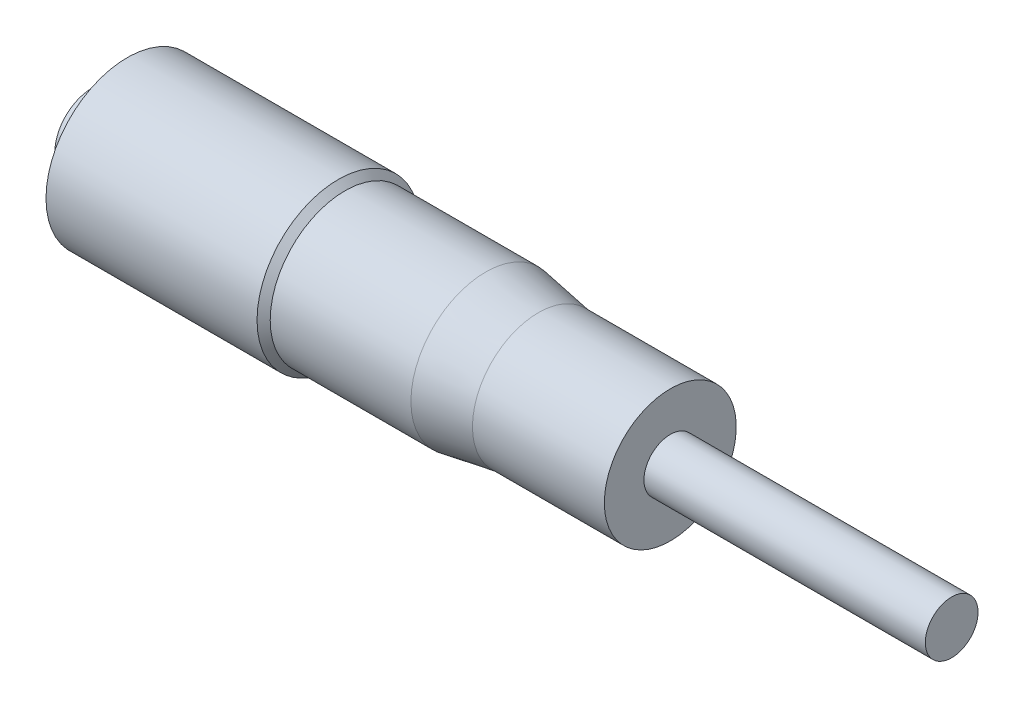
ISO-10303-21;
HEADER;
FILE_DESCRIPTION(('STEP AP214'),'2;1');
FILE_NAME('part.step','',(''),(''),'','','');
FILE_SCHEMA(('AUTOMOTIVE_DESIGN { 1 0 10303 214 1 1 1 1 }'));
ENDSEC;
DATA;
#1=APPLICATION_CONTEXT('core data for automotive mechanical design processes');
#2=APPLICATION_PROTOCOL_DEFINITION('international standard','automotive_design',2000,#1);
#3=PRODUCT_CONTEXT('',#1,'mechanical');
#4=PRODUCT('Part','Part','',(#3));
#5=PRODUCT_RELATED_PRODUCT_CATEGORY('part','',(#4));
#6=PRODUCT_DEFINITION_FORMATION('','',#4);
#7=PRODUCT_DEFINITION_CONTEXT('part definition',#1,'design');
#8=PRODUCT_DEFINITION('design','',#6,#7);
#9=PRODUCT_DEFINITION_SHAPE('','',#8);
#10=(LENGTH_UNIT() NAMED_UNIT(*) SI_UNIT(.MILLI.,.METRE.));
#11=(NAMED_UNIT(*) PLANE_ANGLE_UNIT() SI_UNIT($,.RADIAN.));
#12=(NAMED_UNIT(*) SI_UNIT($,.STERADIAN.) SOLID_ANGLE_UNIT());
#13=UNCERTAINTY_MEASURE_WITH_UNIT(LENGTH_MEASURE(1.E-05),#10,'distance_accuracy_value','');
#14=(GEOMETRIC_REPRESENTATION_CONTEXT(3) GLOBAL_UNCERTAINTY_ASSIGNED_CONTEXT((#13)) GLOBAL_UNIT_ASSIGNED_CONTEXT((#10,
#11,#12)) REPRESENTATION_CONTEXT('',''));
#15=CARTESIAN_POINT('',(0.,0.,0.));
#16=DIRECTION('',(0.,0.,1.));
#17=DIRECTION('',(1.,0.,0.));
#18=AXIS2_PLACEMENT_3D('',#15,#16,#17);
#19=CARTESIAN_POINT('',(-39.8437499999999,0.,0.));
#20=DIRECTION('',(-1.,0.,0.));
#21=DIRECTION('',(0.,1.,0.));
#22=AXIS2_PLACEMENT_3D('',#19,#20,#21);
#23=SPHERICAL_SURFACE('',#22,9.53125000000007);
#24=CARTESIAN_POINT('',(-48.375,0.,0.));
#25=DIRECTION('',(-1.,0.,0.));
#26=DIRECTION('',(0.,0.,1.));
#27=AXIS2_PLACEMENT_3D('',#24,#25,#26);
#28=CIRCLE('',#27,4.25000000000001);
#29=CARTESIAN_POINT('',(-48.375,0.,4.25000000000001));
#30=VERTEX_POINT('',#29);
#31=EDGE_CURVE('E80',#30,#30,#28,.T.);
#32=ORIENTED_EDGE('',*,*,#31,.T.);
#33=EDGE_LOOP('',(#32));
#34=FACE_BOUND('',#33,.T.);
#35=ADVANCED_FACE('F37',(#34),#23,.T.);
#36=CARTESIAN_POINT('',(49.375,0.,0.));
#37=DIRECTION('',(-1.,0.,0.));
#38=DIRECTION('',(0.,0.,1.));
#39=AXIS2_PLACEMENT_3D('',#36,#37,#38);
#40=PLANE('',#39);
#41=CARTESIAN_POINT('',(49.375,0.,0.));
#42=DIRECTION('',(-1.,0.,0.));
#43=DIRECTION('',(0.,0.,1.));
#44=AXIS2_PLACEMENT_3D('',#41,#42,#43);
#45=CIRCLE('',#44,3.);
#46=CARTESIAN_POINT('',(49.375,0.,3.));
#47=VERTEX_POINT('',#46);
#48=EDGE_CURVE('E10',#47,#47,#45,.T.);
#49=ORIENTED_EDGE('',*,*,#48,.F.);
#50=EDGE_LOOP('',(#49));
#51=FACE_BOUND('',#50,.T.);
#52=ADVANCED_FACE('F135',(#51),#40,.F.);
#53=CARTESIAN_POINT('',(0.,0.,0.));
#54=DIRECTION('',(-1.,0.,0.));
#55=DIRECTION('',(0.,0.,1.));
#56=AXIS2_PLACEMENT_3D('',#53,#54,#55);
#57=CYLINDRICAL_SURFACE('',#56,3.);
#58=CARTESIAN_POINT('',(17.375,0.,0.));
#59=DIRECTION('',(-1.,0.,0.));
#60=DIRECTION('',(0.,0.,1.));
#61=AXIS2_PLACEMENT_3D('',#58,#59,#60);
#62=CIRCLE('',#61,3.);
#63=CARTESIAN_POINT('',(17.375,0.,3.));
#64=VERTEX_POINT('',#63);
#65=EDGE_CURVE('E44',#64,#64,#62,.T.);
#66=ORIENTED_EDGE('',*,*,#65,.F.);
#67=EDGE_LOOP('',(#66));
#68=FACE_BOUND('',#67,.T.);
#69=ORIENTED_EDGE('',*,*,#48,.T.);
#70=EDGE_LOOP('',(#69));
#71=FACE_BOUND('',#70,.T.);
#72=ADVANCED_FACE('F130',(#68,#71),#57,.T.);
#73=CARTESIAN_POINT('',(17.375,3.,0.));
#74=DIRECTION('',(-1.,0.,0.));
#75=DIRECTION('',(0.,0.,1.));
#76=AXIS2_PLACEMENT_3D('',#73,#74,#75);
#77=PLANE('',#76);
#78=CARTESIAN_POINT('',(17.375,0.,0.));
#79=DIRECTION('',(-1.,0.,0.));
#80=DIRECTION('',(0.,0.,1.));
#81=AXIS2_PLACEMENT_3D('',#78,#79,#80);
#82=CIRCLE('',#81,7.50000000000001);
#83=CARTESIAN_POINT('',(17.375,0.,7.50000000000001));
#84=VERTEX_POINT('',#83);
#85=EDGE_CURVE('E49',#84,#84,#82,.T.);
#86=ORIENTED_EDGE('',*,*,#85,.F.);
#87=EDGE_LOOP('',(#86));
#88=FACE_BOUND('',#87,.T.);
#89=ORIENTED_EDGE('',*,*,#65,.T.);
#90=EDGE_LOOP('',(#89));
#91=FACE_BOUND('',#90,.T.);
#92=ADVANCED_FACE('F125',(#88,#91),#77,.F.);
#93=CARTESIAN_POINT('',(0.,0.,0.));
#94=DIRECTION('',(-1.,0.,0.));
#95=DIRECTION('',(0.,0.,1.));
#96=AXIS2_PLACEMENT_3D('',#93,#94,#95);
#97=CYLINDRICAL_SURFACE('',#96,7.50000000000001);
#98=CARTESIAN_POINT('',(2.375,0.,0.));
#99=DIRECTION('',(-1.,0.,0.));
#100=DIRECTION('',(0.,0.,1.));
#101=AXIS2_PLACEMENT_3D('',#98,#99,#100);
#102=CIRCLE('',#101,7.50000000000001);
#103=CARTESIAN_POINT('',(2.375,0.,7.50000000000001));
#104=VERTEX_POINT('',#103);
#105=EDGE_CURVE('E54',#104,#104,#102,.T.);
#106=ORIENTED_EDGE('',*,*,#105,.F.);
#107=EDGE_LOOP('',(#106));
#108=FACE_BOUND('',#107,.T.);
#109=ORIENTED_EDGE('',*,*,#85,.T.);
#110=EDGE_LOOP('',(#109));
#111=FACE_BOUND('',#110,.T.);
#112=ADVANCED_FACE('F119',(#108,#111),#97,.T.);
#113=CARTESIAN_POINT('',(2.375,0.,0.));
#114=DIRECTION('',(-1.,0.,0.));
#115=DIRECTION('',(0.,0.,1.));
#116=AXIS2_PLACEMENT_3D('',#113,#114,#115);
#117=CONICAL_SURFACE('',#116,7.50000000000001,0.165148677414626);
#118=CARTESIAN_POINT('',(-3.625,0.,0.));
#119=DIRECTION('',(-1.,0.,0.));
#120=DIRECTION('',(0.,0.,1.));
#121=AXIS2_PLACEMENT_3D('',#118,#119,#120);
#122=CIRCLE('',#121,8.5);
#123=CARTESIAN_POINT('',(-3.625,0.,8.5));
#124=VERTEX_POINT('',#123);
#125=EDGE_CURVE('E60',#124,#124,#122,.T.);
#126=ORIENTED_EDGE('',*,*,#125,.F.);
#127=EDGE_LOOP('',(#126));
#128=FACE_BOUND('',#127,.T.);
#129=ORIENTED_EDGE('',*,*,#105,.T.);
#130=EDGE_LOOP('',(#129));
#131=FACE_BOUND('',#130,.T.);
#132=ADVANCED_FACE('F113',(#128,#131),#117,.T.);
#133=CARTESIAN_POINT('',(0.,0.,0.));
#134=DIRECTION('',(-1.,0.,0.));
#135=DIRECTION('',(0.,0.,1.));
#136=AXIS2_PLACEMENT_3D('',#133,#134,#135);
#137=CYLINDRICAL_SURFACE('',#136,8.5);
#138=CARTESIAN_POINT('',(-19.625,0.,0.));
#139=DIRECTION('',(-1.,0.,0.));
#140=DIRECTION('',(0.,0.,1.));
#141=AXIS2_PLACEMENT_3D('',#138,#139,#140);
#142=CIRCLE('',#141,8.50000000000001);
#143=CARTESIAN_POINT('',(-19.625,0.,8.50000000000001));
#144=VERTEX_POINT('',#143);
#145=EDGE_CURVE('E64',#144,#144,#142,.T.);
#146=ORIENTED_EDGE('',*,*,#145,.F.);
#147=EDGE_LOOP('',(#146));
#148=FACE_BOUND('',#147,.T.);
#149=ORIENTED_EDGE('',*,*,#125,.T.);
#150=EDGE_LOOP('',(#149));
#151=FACE_BOUND('',#150,.T.);
#152=ADVANCED_FACE('F107',(#148,#151),#137,.T.);
#153=CARTESIAN_POINT('',(-19.625,0.,0.));
#154=DIRECTION('',(-1.,0.,0.));
#155=DIRECTION('',(0.,0.,1.));
#156=AXIS2_PLACEMENT_3D('',#153,#154,#155);
#157=CONICAL_SURFACE('',#156,8.50000000000001,0.785398163397451);
#158=CARTESIAN_POINT('',(-20.375,0.,0.));
#159=DIRECTION('',(-1.,0.,0.));
#160=DIRECTION('',(0.,0.,1.));
#161=AXIS2_PLACEMENT_3D('',#158,#159,#160);
#162=CIRCLE('',#161,9.25);
#163=CARTESIAN_POINT('',(-20.375,0.,9.25));
#164=VERTEX_POINT('',#163);
#165=EDGE_CURVE('E68',#164,#164,#162,.T.);
#166=ORIENTED_EDGE('',*,*,#165,.F.);
#167=EDGE_LOOP('',(#166));
#168=FACE_BOUND('',#167,.T.);
#169=ORIENTED_EDGE('',*,*,#145,.T.);
#170=EDGE_LOOP('',(#169));
#171=FACE_BOUND('',#170,.T.);
#172=ADVANCED_FACE('F101',(#168,#171),#157,.T.);
#173=CARTESIAN_POINT('',(0.,0.,0.));
#174=DIRECTION('',(-1.,0.,0.));
#175=DIRECTION('',(0.,0.,1.));
#176=AXIS2_PLACEMENT_3D('',#173,#174,#175);
#177=CYLINDRICAL_SURFACE('',#176,9.25);
#178=CARTESIAN_POINT('',(-44.375,0.,0.));
#179=DIRECTION('',(-1.,0.,0.));
#180=DIRECTION('',(0.,0.,1.));
#181=AXIS2_PLACEMENT_3D('',#178,#179,#180);
#182=CIRCLE('',#181,9.25);
#183=CARTESIAN_POINT('',(-44.375,0.,9.25));
#184=VERTEX_POINT('',#183);
#185=EDGE_CURVE('E72',#184,#184,#182,.T.);
#186=ORIENTED_EDGE('',*,*,#185,.F.);
#187=EDGE_LOOP('',(#186));
#188=FACE_BOUND('',#187,.T.);
#189=ORIENTED_EDGE('',*,*,#165,.T.);
#190=EDGE_LOOP('',(#189));
#191=FACE_BOUND('',#190,.T.);
#192=ADVANCED_FACE('F95',(#188,#191),#177,.T.);
#193=CARTESIAN_POINT('',(-44.375,0.,0.));
#194=DIRECTION('',(1.,0.,0.));
#195=DIRECTION('',(0.,0.,-1.));
#196=AXIS2_PLACEMENT_3D('',#193,#194,#195);
#197=CONICAL_SURFACE('',#196,9.25,1.27933953231703);
#198=CARTESIAN_POINT('',(-45.875,0.,0.));
#199=DIRECTION('',(-1.,0.,0.));
#200=DIRECTION('',(0.,0.,1.));
#201=AXIS2_PLACEMENT_3D('',#198,#199,#200);
#202=CIRCLE('',#201,4.25);
#203=CARTESIAN_POINT('',(-45.875,0.,4.25));
#204=VERTEX_POINT('',#203);
#205=EDGE_CURVE('E76',#204,#204,#202,.T.);
#206=ORIENTED_EDGE('',*,*,#205,.F.);
#207=EDGE_LOOP('',(#206));
#208=FACE_BOUND('',#207,.T.);
#209=ORIENTED_EDGE('',*,*,#185,.T.);
#210=EDGE_LOOP('',(#209));
#211=FACE_BOUND('',#210,.T.);
#212=ADVANCED_FACE('F89',(#208,#211),#197,.T.);
#213=CARTESIAN_POINT('',(0.,0.,0.));
#214=DIRECTION('',(-1.,0.,0.));
#215=DIRECTION('',(0.,0.,1.));
#216=AXIS2_PLACEMENT_3D('',#213,#214,#215);
#217=CYLINDRICAL_SURFACE('',#216,4.25);
#218=ORIENTED_EDGE('',*,*,#31,.F.);
#219=EDGE_LOOP('',(#218));
#220=FACE_BOUND('',#219,.T.);
#221=ORIENTED_EDGE('',*,*,#205,.T.);
#222=EDGE_LOOP('',(#221));
#223=FACE_BOUND('',#222,.T.);
#224=ADVANCED_FACE('F86',(#220,#223),#217,.T.);
#225=CLOSED_SHELL('',(#35,#52,#72,#92,#112,#132,#152,#172,#192,#212,#224));
#226=MANIFOLD_SOLID_BREP('B2',#225);
#227=ADVANCED_BREP_SHAPE_REPRESENTATION('',(#18,#226),#14);
#228=SHAPE_DEFINITION_REPRESENTATION(#9,#227);
ENDSEC;
END-ISO-10303-21;
